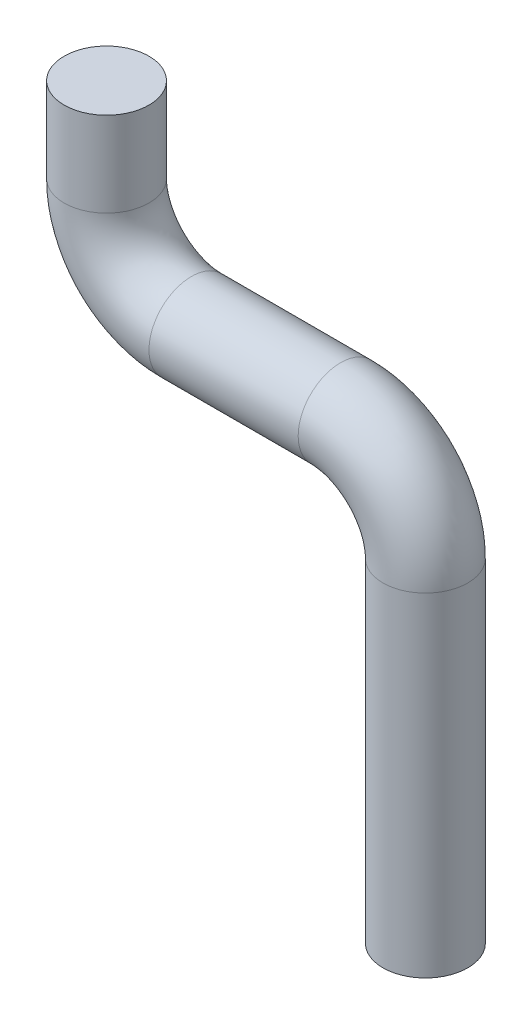
ISO-10303-21;
HEADER;
FILE_DESCRIPTION(('STEP AP214'),'2;1');
FILE_NAME('part.step','',(''),(''),'','','');
FILE_SCHEMA(('AUTOMOTIVE_DESIGN { 1 0 10303 214 1 1 1 1 }'));
ENDSEC;
DATA;
#1=APPLICATION_CONTEXT('core data for automotive mechanical design processes');
#2=APPLICATION_PROTOCOL_DEFINITION('international standard','automotive_design',2000,#1);
#3=PRODUCT_CONTEXT('',#1,'mechanical');
#4=PRODUCT('Part','Part','',(#3));
#5=PRODUCT_RELATED_PRODUCT_CATEGORY('part','',(#4));
#6=PRODUCT_DEFINITION_FORMATION('','',#4);
#7=PRODUCT_DEFINITION_CONTEXT('part definition',#1,'design');
#8=PRODUCT_DEFINITION('design','',#6,#7);
#9=PRODUCT_DEFINITION_SHAPE('','',#8);
#10=(LENGTH_UNIT() NAMED_UNIT(*) SI_UNIT(.MILLI.,.METRE.));
#11=(NAMED_UNIT(*) PLANE_ANGLE_UNIT() SI_UNIT($,.RADIAN.));
#12=(NAMED_UNIT(*) SI_UNIT($,.STERADIAN.) SOLID_ANGLE_UNIT());
#13=UNCERTAINTY_MEASURE_WITH_UNIT(LENGTH_MEASURE(1.E-05),#10,'distance_accuracy_value','');
#14=(GEOMETRIC_REPRESENTATION_CONTEXT(3) GLOBAL_UNCERTAINTY_ASSIGNED_CONTEXT((#13)) GLOBAL_UNIT_ASSIGNED_CONTEXT((#10,
#11,#12)) REPRESENTATION_CONTEXT('',''));
#15=CARTESIAN_POINT('',(0.,0.,0.));
#16=DIRECTION('',(0.,0.,1.));
#17=DIRECTION('',(1.,0.,0.));
#18=AXIS2_PLACEMENT_3D('',#15,#16,#17);
#19=CARTESIAN_POINT('',(15.9609129856386,-35.2064492605275,0.));
#20=DIRECTION('',(0.,1.,0.));
#21=DIRECTION('',(0.,0.,1.));
#22=AXIS2_PLACEMENT_3D('',#19,#20,#21);
#23=PLANE('',#22);
#24=CARTESIAN_POINT('',(15.9609129856386,-35.2064492605275,0.));
#25=DIRECTION('',(0.,1.,0.));
#26=DIRECTION('',(0.,0.,1.));
#27=AXIS2_PLACEMENT_3D('',#24,#25,#26);
#28=CIRCLE('',#27,5.);
#29=CARTESIAN_POINT('',(15.9609129856386,-35.2064492605275,5.));
#30=VERTEX_POINT('',#29);
#31=EDGE_CURVE('E64',#30,#30,#28,.T.);
#32=ORIENTED_EDGE('',*,*,#31,.F.);
#33=EDGE_LOOP('',(#32));
#34=FACE_BOUND('',#33,.T.);
#35=ADVANCED_FACE('F37',(#34),#23,.F.);
#36=CARTESIAN_POINT('',(-21.6311888941854,34.097038204934,0.));
#37=DIRECTION('',(0.,1.,0.));
#38=DIRECTION('',(0.,0.,1.));
#39=AXIS2_PLACEMENT_3D('',#36,#37,#38);
#40=PLANE('',#39);
#41=CARTESIAN_POINT('',(-21.6311888941854,34.097038204934,0.));
#42=DIRECTION('',(0.,1.,0.));
#43=DIRECTION('',(0.,0.,1.));
#44=AXIS2_PLACEMENT_3D('',#41,#42,#43);
#45=CIRCLE('',#44,5.);
#46=CARTESIAN_POINT('',(-21.6311888941854,34.097038204934,5.));
#47=VERTEX_POINT('',#46);
#48=EDGE_CURVE('E10',#47,#47,#45,.T.);
#49=ORIENTED_EDGE('',*,*,#48,.T.);
#50=EDGE_LOOP('',(#49));
#51=FACE_BOUND('',#50,.T.);
#52=ADVANCED_FACE('F72',(#51),#40,.T.);
#53=CARTESIAN_POINT('',(15.9609129856386,-35.2064492605275,0.));
#54=DIRECTION('',(0.,1.,0.));
#55=DIRECTION('',(0.,0.,1.));
#56=AXIS2_PLACEMENT_3D('',#53,#54,#55);
#57=CYLINDRICAL_SURFACE('',#56,5.);
#58=CARTESIAN_POINT('',(15.9609129856386,4.09703820493396,0.));
#59=DIRECTION('',(0.,1.,0.));
#60=DIRECTION('',(0.,0.,1.));
#61=AXIS2_PLACEMENT_3D('',#58,#59,#60);
#62=CIRCLE('',#61,5.);
#63=CARTESIAN_POINT('',(20.9609129856389,4.09703820493392,0.));
#64=VERTEX_POINT('',#63);
#65=EDGE_CURVE('E60',#64,#64,#62,.T.);
#66=ORIENTED_EDGE('',*,*,#65,.F.);
#67=EDGE_LOOP('',(#66));
#68=FACE_BOUND('',#67,.T.);
#69=ORIENTED_EDGE('',*,*,#31,.T.);
#70=EDGE_LOOP('',(#69));
#71=FACE_BOUND('',#70,.T.);
#72=ADVANCED_FACE('F69',(#68,#71),#57,.T.);
#73=CARTESIAN_POINT('',(5.96091298563863,4.09703820493403,0.));
#74=DIRECTION('',(0.,0.,1.));
#75=DIRECTION('',(1.,0.,0.));
#76=AXIS2_PLACEMENT_3D('',#73,#74,#75);
#77=TOROIDAL_SURFACE('',#76,10.0000000000003,5.);
#78=CARTESIAN_POINT('',(5.96091298563856,14.097038204934,0.));
#79=DIRECTION('',(-1.,0.,0.));
#80=DIRECTION('',(0.,0.,1.));
#81=AXIS2_PLACEMENT_3D('',#78,#79,#80);
#82=CIRCLE('',#81,5.);
#83=CARTESIAN_POINT('',(5.96091298563853,19.0970382049343,0.));
#84=VERTEX_POINT('',#83);
#85=EDGE_CURVE('E54',#84,#84,#82,.T.);
#86=CARTESIAN_POINT('',(5.96091298563863,4.09703820493403,0.));
#87=DIRECTION('',(0.,0.,1.));
#88=DIRECTION('',(1.,0.,0.));
#89=AXIS2_PLACEMENT_3D('',#86,#87,#88);
#90=CIRCLE('',#89,15.0000000000003);
#91=EDGE_CURVE('',#64,#84,#90,.T.);
#92=ORIENTED_EDGE('',*,*,#65,.T.);
#93=ORIENTED_EDGE('',*,*,#85,.F.);
#94=ORIENTED_EDGE('',*,*,#91,.T.);
#95=ORIENTED_EDGE('',*,*,#91,.F.);
#96=EDGE_LOOP('',(#92,#94,#93,#95));
#97=FACE_BOUND('',#96,.T.);
#98=ADVANCED_FACE('F90',(#97),#77,.T.);
#99=CARTESIAN_POINT('',(5.96091298563856,14.097038204934,0.));
#100=DIRECTION('',(-1.,0.,0.));
#101=DIRECTION('',(0.,0.,1.));
#102=AXIS2_PLACEMENT_3D('',#99,#100,#101);
#103=CYLINDRICAL_SURFACE('',#102,5.);
#104=CARTESIAN_POINT('',(-11.6311888941854,14.097038204934,0.));
#105=DIRECTION('',(-1.,0.,0.));
#106=DIRECTION('',(0.,0.,1.));
#107=AXIS2_PLACEMENT_3D('',#104,#105,#106);
#108=CIRCLE('',#107,5.);
#109=CARTESIAN_POINT('',(-11.6311888941853,9.09703820493402,0.));
#110=VERTEX_POINT('',#109);
#111=EDGE_CURVE('E49',#110,#110,#108,.T.);
#112=ORIENTED_EDGE('',*,*,#111,.F.);
#113=EDGE_LOOP('',(#112));
#114=FACE_BOUND('',#113,.T.);
#115=ORIENTED_EDGE('',*,*,#85,.T.);
#116=EDGE_LOOP('',(#115));
#117=FACE_BOUND('',#116,.T.);
#118=ADVANCED_FACE('F84',(#114,#117),#103,.T.);
#119=CARTESIAN_POINT('',(-11.6311888941855,24.097038204934,0.));
#120=DIRECTION('',(0.,0.,-1.));
#121=DIRECTION('',(-1.,0.,0.));
#122=AXIS2_PLACEMENT_3D('',#119,#120,#121);
#123=TOROIDAL_SURFACE('',#122,10.,5.);
#124=CARTESIAN_POINT('',(-21.6311888941854,24.097038204934,0.));
#125=DIRECTION('',(0.,1.,0.));
#126=DIRECTION('',(0.,0.,1.));
#127=AXIS2_PLACEMENT_3D('',#124,#125,#126);
#128=CIRCLE('',#127,5.);
#129=CARTESIAN_POINT('',(-26.6311888941855,24.097038204934,0.));
#130=VERTEX_POINT('',#129);
#131=EDGE_CURVE('E44',#130,#130,#128,.T.);
#132=CARTESIAN_POINT('',(-11.6311888941855,24.097038204934,0.));
#133=DIRECTION('',(0.,0.,-1.));
#134=DIRECTION('',(-1.,0.,0.));
#135=AXIS2_PLACEMENT_3D('',#132,#133,#134);
#136=CIRCLE('',#135,15.);
#137=EDGE_CURVE('',#110,#130,#136,.T.);
#138=ORIENTED_EDGE('',*,*,#111,.T.);
#139=ORIENTED_EDGE('',*,*,#131,.F.);
#140=ORIENTED_EDGE('',*,*,#137,.T.);
#141=ORIENTED_EDGE('',*,*,#137,.F.);
#142=EDGE_LOOP('',(#138,#140,#139,#141));
#143=FACE_BOUND('',#142,.T.);
#144=ADVANCED_FACE('F78',(#143),#123,.T.);
#145=CARTESIAN_POINT('',(-21.6311888941854,24.097038204934,0.));
#146=DIRECTION('',(0.,1.,0.));
#147=DIRECTION('',(0.,0.,1.));
#148=AXIS2_PLACEMENT_3D('',#145,#146,#147);
#149=CYLINDRICAL_SURFACE('',#148,5.);
#150=ORIENTED_EDGE('',*,*,#48,.F.);
#151=EDGE_LOOP('',(#150));
#152=FACE_BOUND('',#151,.T.);
#153=ORIENTED_EDGE('',*,*,#131,.T.);
#154=EDGE_LOOP('',(#153));
#155=FACE_BOUND('',#154,.T.);
#156=ADVANCED_FACE('F76',(#152,#155),#149,.T.);
#157=CLOSED_SHELL('',(#35,#52,#72,#98,#118,#144,#156));
#158=MANIFOLD_SOLID_BREP('B2',#157);
#159=ADVANCED_BREP_SHAPE_REPRESENTATION('',(#18,#158),#14);
#160=SHAPE_DEFINITION_REPRESENTATION(#9,#159);
ENDSEC;
END-ISO-10303-21;
